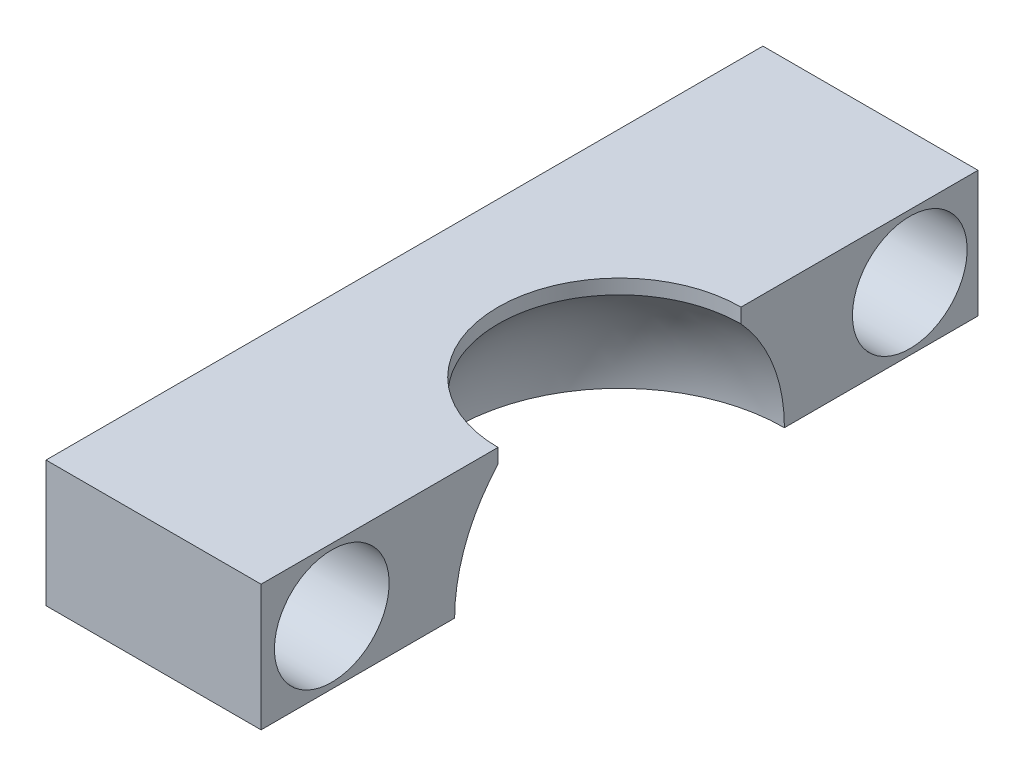
ISO-10303-21;
HEADER;
FILE_DESCRIPTION(('STEP AP214'),'2;1');
FILE_NAME('part.step','',(''),(''),'','','');
FILE_SCHEMA(('AUTOMOTIVE_DESIGN { 1 0 10303 214 1 1 1 1 }'));
ENDSEC;
DATA;
#1=APPLICATION_CONTEXT('core data for automotive mechanical design processes');
#2=APPLICATION_PROTOCOL_DEFINITION('international standard','automotive_design',2000,#1);
#3=PRODUCT_CONTEXT('',#1,'mechanical');
#4=PRODUCT('Part','Part','',(#3));
#5=PRODUCT_RELATED_PRODUCT_CATEGORY('part','',(#4));
#6=PRODUCT_DEFINITION_FORMATION('','',#4);
#7=PRODUCT_DEFINITION_CONTEXT('part definition',#1,'design');
#8=PRODUCT_DEFINITION('design','',#6,#7);
#9=PRODUCT_DEFINITION_SHAPE('','',#8);
#10=(LENGTH_UNIT() NAMED_UNIT(*) SI_UNIT(.MILLI.,.METRE.));
#11=(NAMED_UNIT(*) PLANE_ANGLE_UNIT() SI_UNIT($,.RADIAN.));
#12=(NAMED_UNIT(*) SI_UNIT($,.STERADIAN.) SOLID_ANGLE_UNIT());
#13=UNCERTAINTY_MEASURE_WITH_UNIT(LENGTH_MEASURE(1.E-05),#10,'distance_accuracy_value','');
#14=(GEOMETRIC_REPRESENTATION_CONTEXT(3) GLOBAL_UNCERTAINTY_ASSIGNED_CONTEXT((#13)) GLOBAL_UNIT_ASSIGNED_CONTEXT((#10,
#11,#12)) REPRESENTATION_CONTEXT('',''));
#15=CARTESIAN_POINT('',(0.,0.,0.));
#16=DIRECTION('',(0.,0.,1.));
#17=DIRECTION('',(1.,0.,0.));
#18=AXIS2_PLACEMENT_3D('',#15,#16,#17);
#19=CARTESIAN_POINT('',(1.5,1.56,-5.));
#20=DIRECTION('',(-1.,0.,0.));
#21=DIRECTION('',(0.,0.,1.));
#22=AXIS2_PLACEMENT_3D('',#19,#20,#21);
#23=PLANE('',#22);
#24=CARTESIAN_POINT('',(1.5,0.881745601262196,4.01387258980179));
#25=DIRECTION('',(-1.,0.,0.));
#26=DIRECTION('',(0.,0.,1.));
#27=AXIS2_PLACEMENT_3D('',#24,#25,#26);
#28=CIRCLE('',#27,0.8);
#29=CARTESIAN_POINT('',(1.5,0.881745601262196,4.81387258980179));
#30=VERTEX_POINT('',#29);
#31=EDGE_CURVE('E125',#30,#30,#28,.T.);
#32=ORIENTED_EDGE('',*,*,#31,.T.);
#33=EDGE_LOOP('',(#32));
#34=FACE_BOUND('',#33,.T.);
#35=DIRECTION('',(0.,0.,-1.));
#36=VECTOR('',#35,1.);
#37=CARTESIAN_POINT('',(1.5,0.,-5.));
#38=LINE('',#37,#36);
#39=CARTESIAN_POINT('',(1.5,0.,5.));
#40=VERTEX_POINT('',#39);
#41=CARTESIAN_POINT('',(1.5,0.,2.3));
#42=VERTEX_POINT('',#41);
#43=EDGE_CURVE('E190',#40,#42,#38,.T.);
#44=ORIENTED_EDGE('',*,*,#43,.T.);
#45=CARTESIAN_POINT('',(1.5,0.,0.));
#46=DIRECTION('',(-1.,0.,0.));
#47=DIRECTION('',(0.,0.,1.));
#48=AXIS2_PLACEMENT_3D('',#45,#46,#47);
#49=CIRCLE('',#48,2.3);
#50=CARTESIAN_POINT('',(1.5,1.56,1.69254437753292));
#51=VERTEX_POINT('',#50);
#52=EDGE_CURVE('E43',#42,#51,#49,.T.);
#53=ORIENTED_EDGE('',*,*,#52,.T.);
#54=DIRECTION('',(0.,-1.,0.));
#55=VECTOR('',#54,1.);
#56=CARTESIAN_POINT('',(1.5,1.76,1.695));
#57=LINE('',#56,#55);
#58=CARTESIAN_POINT('',(1.5,1.76,1.695));
#59=VERTEX_POINT('',#58);
#60=EDGE_CURVE('E113',#59,#51,#57,.T.);
#61=ORIENTED_EDGE('',*,*,#60,.F.);
#62=DIRECTION('',(0.,0.,-1.));
#63=VECTOR('',#62,1.);
#64=CARTESIAN_POINT('',(1.5,1.76,1.695));
#65=LINE('',#64,#63);
#66=CARTESIAN_POINT('',(1.5,1.76,5.));
#67=VERTEX_POINT('',#66);
#68=EDGE_CURVE('E111',#67,#59,#65,.T.);
#69=ORIENTED_EDGE('',*,*,#68,.F.);
#70=DIRECTION('',(0.,-1.,0.));
#71=VECTOR('',#70,1.);
#72=CARTESIAN_POINT('',(1.5,1.56,5.));
#73=LINE('',#72,#71);
#74=EDGE_CURVE('E99',#67,#40,#73,.T.);
#75=ORIENTED_EDGE('',*,*,#74,.T.);
#76=EDGE_LOOP('',(#44,#53,#61,#69,#75));
#77=FACE_BOUND('',#76,.T.);
#78=ADVANCED_FACE('F39',(#34,#77),#23,.F.);
#79=CARTESIAN_POINT('',(1.5,0.88,-4.04863887629148));
#80=DIRECTION('',(-1.,0.,0.));
#81=DIRECTION('',(0.,0.,1.));
#82=AXIS2_PLACEMENT_3D('',#79,#80,#81);
#83=CIRCLE('',#82,0.8);
#84=CARTESIAN_POINT('',(1.5,0.88,-3.24863887629148));
#85=VERTEX_POINT('',#84);
#86=EDGE_CURVE('E129',#85,#85,#83,.T.);
#87=ORIENTED_EDGE('',*,*,#86,.T.);
#88=EDGE_LOOP('',(#87));
#89=FACE_BOUND('',#88,.T.);
#90=DIRECTION('',(0.,-1.,0.));
#91=VECTOR('',#90,1.);
#92=CARTESIAN_POINT('',(1.5,1.56,-5.));
#93=LINE('',#92,#91);
#94=CARTESIAN_POINT('',(1.5,1.76,-5.));
#95=VERTEX_POINT('',#94);
#96=CARTESIAN_POINT('',(1.5,0.,-5.));
#97=VERTEX_POINT('',#96);
#98=EDGE_CURVE('E50',#95,#97,#93,.T.);
#99=ORIENTED_EDGE('',*,*,#98,.F.);
#100=DIRECTION('',(0.,0.,-1.));
#101=VECTOR('',#100,1.);
#102=CARTESIAN_POINT('',(1.5,1.76,-5.));
#103=LINE('',#102,#101);
#104=CARTESIAN_POINT('',(1.5,1.76,-1.695));
#105=VERTEX_POINT('',#104);
#106=EDGE_CURVE('E135',#105,#95,#103,.T.);
#107=ORIENTED_EDGE('',*,*,#106,.F.);
#108=DIRECTION('',(0.,-1.,0.));
#109=VECTOR('',#108,1.);
#110=CARTESIAN_POINT('',(1.5,1.76,-1.695));
#111=LINE('',#110,#109);
#112=CARTESIAN_POINT('',(1.5,1.56,-1.69254437753292));
#113=VERTEX_POINT('',#112);
#114=EDGE_CURVE('E144',#105,#113,#111,.T.);
#115=ORIENTED_EDGE('',*,*,#114,.T.);
#116=CARTESIAN_POINT('',(1.5,0.,-2.3));
#117=VERTEX_POINT('',#116);
#118=EDGE_CURVE('E177',#113,#117,#49,.T.);
#119=ORIENTED_EDGE('',*,*,#118,.T.);
#120=EDGE_CURVE('E195',#117,#97,#38,.T.);
#121=ORIENTED_EDGE('',*,*,#120,.T.);
#122=EDGE_LOOP('',(#99,#107,#115,#119,#121));
#123=FACE_BOUND('',#122,.T.);
#124=ADVANCED_FACE('F41',(#89,#123),#23,.F.);
#125=CARTESIAN_POINT('',(-1.5,1.56,-5.));
#126=DIRECTION('',(0.,0.,1.));
#127=DIRECTION('',(1.,0.,0.));
#128=AXIS2_PLACEMENT_3D('',#125,#126,#127);
#129=PLANE('',#128);
#130=DIRECTION('',(-1.,0.,0.));
#131=VECTOR('',#130,1.);
#132=CARTESIAN_POINT('',(-1.5,0.,-5.));
#133=LINE('',#132,#131);
#134=CARTESIAN_POINT('',(-1.5,0.,-5.));
#135=VERTEX_POINT('',#134);
#136=EDGE_CURVE('E194',#97,#135,#133,.T.);
#137=ORIENTED_EDGE('',*,*,#136,.T.);
#138=DIRECTION('',(0.,-1.,0.));
#139=VECTOR('',#138,1.);
#140=CARTESIAN_POINT('',(-1.5,1.56,-5.));
#141=LINE('',#140,#139);
#142=CARTESIAN_POINT('',(-1.5,1.76,-5.));
#143=VERTEX_POINT('',#142);
#144=EDGE_CURVE('E205',#143,#135,#141,.T.);
#145=ORIENTED_EDGE('',*,*,#144,.F.);
#146=DIRECTION('',(-1.,0.,0.));
#147=VECTOR('',#146,1.);
#148=CARTESIAN_POINT('',(-1.5,1.76,-5.));
#149=LINE('',#148,#147);
#150=EDGE_CURVE('E139',#95,#143,#149,.T.);
#151=ORIENTED_EDGE('',*,*,#150,.F.);
#152=ORIENTED_EDGE('',*,*,#98,.T.);
#153=EDGE_LOOP('',(#137,#145,#151,#152));
#154=FACE_BOUND('',#153,.T.);
#155=ADVANCED_FACE('F213',(#154),#129,.F.);
#156=CARTESIAN_POINT('',(-1.5,1.56,-5.));
#157=DIRECTION('',(1.,0.,0.));
#158=DIRECTION('',(0.,0.,-1.));
#159=AXIS2_PLACEMENT_3D('',#156,#157,#158);
#160=PLANE('',#159);
#161=CARTESIAN_POINT('',(-1.5,0.881745601262196,4.01387258980179));
#162=DIRECTION('',(-1.,0.,0.));
#163=DIRECTION('',(0.,0.,1.));
#164=AXIS2_PLACEMENT_3D('',#161,#162,#163);
#165=CIRCLE('',#164,0.8);
#166=CARTESIAN_POINT('',(-1.5,0.881745601262196,4.81387258980179));
#167=VERTEX_POINT('',#166);
#168=EDGE_CURVE('E255',#167,#167,#165,.T.);
#169=ORIENTED_EDGE('',*,*,#168,.F.);
#170=EDGE_LOOP('',(#169));
#171=FACE_BOUND('',#170,.T.);
#172=CARTESIAN_POINT('',(-1.5,0.88,-4.04863887629148));
#173=DIRECTION('',(-1.,0.,0.));
#174=DIRECTION('',(0.,0.,1.));
#175=AXIS2_PLACEMENT_3D('',#172,#173,#174);
#176=CIRCLE('',#175,0.8);
#177=CARTESIAN_POINT('',(-1.5,0.88,-3.24863887629148));
#178=VERTEX_POINT('',#177);
#179=EDGE_CURVE('E257',#178,#178,#176,.T.);
#180=ORIENTED_EDGE('',*,*,#179,.F.);
#181=EDGE_LOOP('',(#180));
#182=FACE_BOUND('',#181,.T.);
#183=DIRECTION('',(0.,0.,1.));
#184=VECTOR('',#183,1.);
#185=CARTESIAN_POINT('',(-1.5,0.,-5.));
#186=LINE('',#185,#184);
#187=CARTESIAN_POINT('',(-1.5,0.,5.));
#188=VERTEX_POINT('',#187);
#189=EDGE_CURVE('E198',#135,#188,#186,.T.);
#190=ORIENTED_EDGE('',*,*,#189,.T.);
#191=DIRECTION('',(0.,-1.,0.));
#192=VECTOR('',#191,1.);
#193=CARTESIAN_POINT('',(-1.5,1.56,5.));
#194=LINE('',#193,#192);
#195=CARTESIAN_POINT('',(-1.5,1.76,5.));
#196=VERTEX_POINT('',#195);
#197=EDGE_CURVE('E108',#196,#188,#194,.T.);
#198=ORIENTED_EDGE('',*,*,#197,.F.);
#199=DIRECTION('',(0.,0.,1.));
#200=VECTOR('',#199,1.);
#201=CARTESIAN_POINT('',(-1.5,1.76,-5.));
#202=LINE('',#201,#200);
#203=EDGE_CURVE('E123',#143,#196,#202,.T.);
#204=ORIENTED_EDGE('',*,*,#203,.F.);
#205=ORIENTED_EDGE('',*,*,#144,.T.);
#206=EDGE_LOOP('',(#190,#198,#204,#205));
#207=FACE_BOUND('',#206,.T.);
#208=ADVANCED_FACE('F227',(#171,#182,#207),#160,.F.);
#209=CARTESIAN_POINT('',(-1.5,1.56,5.));
#210=DIRECTION('',(0.,0.,-1.));
#211=DIRECTION('',(-1.,0.,0.));
#212=AXIS2_PLACEMENT_3D('',#209,#210,#211);
#213=PLANE('',#212);
#214=DIRECTION('',(1.,0.,0.));
#215=VECTOR('',#214,1.);
#216=CARTESIAN_POINT('',(-1.5,0.,5.));
#217=LINE('',#216,#215);
#218=EDGE_CURVE('E64',#188,#40,#217,.T.);
#219=ORIENTED_EDGE('',*,*,#218,.T.);
#220=ORIENTED_EDGE('',*,*,#74,.F.);
#221=DIRECTION('',(1.,0.,0.));
#222=VECTOR('',#221,1.);
#223=CARTESIAN_POINT('',(-1.5,1.76,5.));
#224=LINE('',#223,#222);
#225=EDGE_CURVE('E103',#196,#67,#224,.T.);
#226=ORIENTED_EDGE('',*,*,#225,.F.);
#227=ORIENTED_EDGE('',*,*,#197,.T.);
#228=EDGE_LOOP('',(#219,#220,#226,#227));
#229=FACE_BOUND('',#228,.T.);
#230=ADVANCED_FACE('F101',(#229),#213,.F.);
#231=CARTESIAN_POINT('',(0.,0.,0.));
#232=DIRECTION('',(0.,1.,0.));
#233=DIRECTION('',(0.,0.,1.));
#234=AXIS2_PLACEMENT_3D('',#231,#232,#233);
#235=PLANE('',#234);
#236=ORIENTED_EDGE('',*,*,#120,.F.);
#237=CARTESIAN_POINT('',(1.5,0.,0.));
#238=DIRECTION('',(0.,1.,0.));
#239=DIRECTION('',(0.,0.,1.));
#240=AXIS2_PLACEMENT_3D('',#237,#238,#239);
#241=CIRCLE('',#240,2.3);
#242=EDGE_CURVE('E11',#117,#42,#241,.T.);
#243=ORIENTED_EDGE('',*,*,#242,.T.);
#244=ORIENTED_EDGE('',*,*,#43,.F.);
#245=ORIENTED_EDGE('',*,*,#218,.F.);
#246=ORIENTED_EDGE('',*,*,#189,.F.);
#247=ORIENTED_EDGE('',*,*,#136,.F.);
#248=EDGE_LOOP('',(#236,#243,#244,#245,#246,#247));
#249=FACE_BOUND('',#248,.T.);
#250=ADVANCED_FACE('F171',(#249),#235,.F.);
#251=CARTESIAN_POINT('',(1.5,0.,0.));
#252=DIRECTION('',(0.,1.,0.));
#253=DIRECTION('',(1.,0.,0.));
#254=AXIS2_PLACEMENT_3D('',#251,#252,#253);
#255=SPHERICAL_SURFACE('',#254,2.3);
#256=CARTESIAN_POINT('',(1.5,1.56,-1.69008875506584));
#257=CARTESIAN_POINT('',(1.47234595948626,1.56,-1.69008934167668));
#258=CARTESIAN_POINT('',(1.44469196888735,1.56,-1.68941004436484));
#259=CARTESIAN_POINT('',(1.38945058187664,1.56,-1.68669589392161));
#260=CARTESIAN_POINT('',(1.36186318546484,1.56,-1.68466104079022));
#261=CARTESIAN_POINT('',(1.30682148118576,1.56,-1.6792399907337));
#262=CARTESIAN_POINT('',(1.27936717331849,1.56,-1.67585379380857));
#263=CARTESIAN_POINT('',(1.22465777687654,1.56,-1.66773839872494));
#264=CARTESIAN_POINT('',(1.19740268830186,1.56,-1.66300920056645));
#265=CARTESIAN_POINT('',(1.14315739277487,1.56,-1.65221914652076));
#266=CARTESIAN_POINT('',(1.11616718582256,1.56,-1.64615829063356));
#267=CARTESIAN_POINT('',(1.06251667466068,1.56,-1.6327195355395));
#268=CARTESIAN_POINT('',(1.03585637045112,1.56,-1.62534163633263));
#269=CARTESIAN_POINT('',(0.982929891957514,1.56,-1.60928656504725));
#270=CARTESIAN_POINT('',(0.956663717673473,1.56,-1.60060939296875));
#271=CARTESIAN_POINT('',(0.904588776498582,1.56,-1.58197668096086));
#272=CARTESIAN_POINT('',(0.878780009607732,1.56,-1.57202114103149));
#273=CARTESIAN_POINT('',(0.82768205881179,1.56,-1.55085567683414));
#274=CARTESIAN_POINT('',(0.802392874906698,1.56,-1.53964575256618));
#275=CARTESIAN_POINT('',(0.752395013938009,1.56,-1.51599852544953));
#276=CARTESIAN_POINT('',(0.727686336874412,1.56,-1.50356122260085));
#277=CARTESIAN_POINT('',(0.678909014956884,1.56,-1.47748920085637));
#278=CARTESIAN_POINT('',(0.654840370102953,1.56,-1.46385448196057));
#279=CARTESIAN_POINT('',(0.607401096078134,1.56,-1.43542047535886));
#280=CARTESIAN_POINT('',(0.584030466907245,1.56,-1.42062118765295));
#281=CARTESIAN_POINT('',(0.538043526141273,1.56,-1.38989369621003));
#282=CARTESIAN_POINT('',(0.51542721454619,1.56,-1.37396549247303));
#283=CARTESIAN_POINT('',(0.471003393607398,1.56,-1.34101854140624));
#284=CARTESIAN_POINT('',(0.44919588426369,1.56,-1.32399979407645));
#285=CARTESIAN_POINT('',(0.406442204027774,1.56,-1.28891275547698));
#286=CARTESIAN_POINT('',(0.385496033135567,1.56,-1.27084446420729));
#287=CARTESIAN_POINT('',(0.344515490962999,1.56,-1.23370186582431));
#288=CARTESIAN_POINT('',(0.324481119682638,1.56,-1.21462755871102));
#289=CARTESIAN_POINT('',(0.285372441288983,1.56,-1.17551888031736));
#290=CARTESIAN_POINT('',(0.266298134175688,1.56,-1.155484509037));
#291=CARTESIAN_POINT('',(0.229155535792712,1.56,-1.11450396686443));
#292=CARTESIAN_POINT('',(0.21108724452303,1.56,-1.09355779597223));
#293=CARTESIAN_POINT('',(0.176000205923544,1.56,-1.05080411573631));
#294=CARTESIAN_POINT('',(0.15898145859374,1.56,-1.0289966063926));
#295=CARTESIAN_POINT('',(0.126034507526992,1.56,-0.984572785453809));
#296=CARTESIAN_POINT('',(0.110106303790049,1.56,-0.961956473858723));
#297=CARTESIAN_POINT('',(0.0793788123469717,1.56,-0.915969533092759));
#298=CARTESIAN_POINT('',(0.0645795246408375,1.56,-0.892598903921881));
#299=CARTESIAN_POINT('',(0.0361455180397269,1.56,-0.845159629897032));
#300=CARTESIAN_POINT('',(0.0225107991447506,1.56,-0.821090985043061));
#301=CARTESIAN_POINT('',(-0.00356122260196587,1.56,-0.772313663125643));
#302=CARTESIAN_POINT('',(-0.015998525453706,1.56,-0.747604986062196));
#303=CARTESIAN_POINT('',(-0.0396457525620013,1.56,-0.697607125093097));
#304=CARTESIAN_POINT('',(-0.0508556768185564,1.56,-0.672317941187445));
#305=CARTESIAN_POINT('',(-0.0720211410470745,1.56,-0.621219990393034));
#306=CARTESIAN_POINT('',(-0.0819766810190375,1.56,-0.595411223504275));
#307=CARTESIAN_POINT('',(-0.100609392910576,1.56,-0.543336282323669));
#308=CARTESIAN_POINT('',(-0.109286564830151,1.56,-0.517070108031821));
#309=CARTESIAN_POINT('',(-0.12534163654973,1.56,-0.464143629559549));
#310=CARTESIAN_POINT('',(-0.132719536349734,1.56,-0.437483325379125));
#311=CARTESIAN_POINT('',(-0.146158289823323,1.56,-0.383832814137639));
#312=CARTESIAN_POINT('',(-0.152219143496909,1.56,-0.356842607076577));
#313=CARTESIAN_POINT('',(-0.163009203590295,1.56,-0.302597311846688));
#314=CARTESIAN_POINT('',(-0.167738410010095,1.56,-0.275342223677861));
#315=CARTESIAN_POINT('',(-0.175853782523414,1.56,-0.220632826127105));
#316=CARTESIAN_POINT('',(-0.179239948616934,1.56,-0.193178516745175));
#317=CARTESIAN_POINT('',(-0.18466108290698,1.56,-0.138136816604227));
#318=CARTESIAN_POINT('',(-0.186696051103507,1.56,-0.11054942584521));
#319=CARTESIAN_POINT('',(-0.189409887182939,1.56,-0.0553080233907947));
#320=CARTESIAN_POINT('',(-0.190088755065845,1.56,-0.0276540116953974));
#321=CARTESIAN_POINT('',(-0.190088755065845,1.56,0.0276540116953973));
#322=CARTESIAN_POINT('',(-0.189409887182939,1.56,0.0553080233907948));
#323=CARTESIAN_POINT('',(-0.186696051103507,1.56,0.11054942584521));
#324=CARTESIAN_POINT('',(-0.18466108290698,1.56,0.138136816604228));
#325=CARTESIAN_POINT('',(-0.179239948616934,1.56,0.193178516745175));
#326=CARTESIAN_POINT('',(-0.175853782523414,1.56,0.220632826127105));
#327=CARTESIAN_POINT('',(-0.167738410010094,1.56,0.275342223677862));
#328=CARTESIAN_POINT('',(-0.163009203590295,1.56,0.302597311846689));
#329=CARTESIAN_POINT('',(-0.152219143496909,1.56,0.356842607076577));
#330=CARTESIAN_POINT('',(-0.146158289823323,1.56,0.383832814137639));
#331=CARTESIAN_POINT('',(-0.132719536349734,1.56,0.437483325379125));
#332=CARTESIAN_POINT('',(-0.12534163654973,1.56,0.464143629559549));
#333=CARTESIAN_POINT('',(-0.109286564830151,1.56,0.517070108031821));
#334=CARTESIAN_POINT('',(-0.100609392910576,1.56,0.543336282323669));
#335=CARTESIAN_POINT('',(-0.0819766810190376,1.56,0.595411223504275));
#336=CARTESIAN_POINT('',(-0.0720211410470747,1.56,0.621219990393034));
#337=CARTESIAN_POINT('',(-0.0508556768185566,1.56,0.672317941187444));
#338=CARTESIAN_POINT('',(-0.0396457525620013,1.56,0.697607125093097));
#339=CARTESIAN_POINT('',(-0.015998525453706,1.56,0.747604986062196));
#340=CARTESIAN_POINT('',(-0.00356122260196604,1.56,0.772313663125643));
#341=CARTESIAN_POINT('',(0.0225107991447506,1.56,0.821090985043061));
#342=CARTESIAN_POINT('',(0.0361455180397273,1.56,0.845159629897033));
#343=CARTESIAN_POINT('',(0.0645795246408378,1.56,0.892598903921881));
#344=CARTESIAN_POINT('',(0.0793788123469716,1.56,0.915969533092759));
#345=CARTESIAN_POINT('',(0.110106303790049,1.56,0.961956473858723));
#346=CARTESIAN_POINT('',(0.126034507526992,1.56,0.984572785453809));
#347=CARTESIAN_POINT('',(0.15898145859374,1.56,1.0289966063926));
#348=CARTESIAN_POINT('',(0.176000205923544,1.56,1.05080411573631));
#349=CARTESIAN_POINT('',(0.21108724452303,1.56,1.09355779597223));
#350=CARTESIAN_POINT('',(0.229155535792712,1.56,1.11450396686443));
#351=CARTESIAN_POINT('',(0.266298134175689,1.56,1.155484509037));
#352=CARTESIAN_POINT('',(0.285372441288983,1.56,1.17551888031736));
#353=CARTESIAN_POINT('',(0.324481119682638,1.56,1.21462755871102));
#354=CARTESIAN_POINT('',(0.344515490962999,1.56,1.23370186582431));
#355=CARTESIAN_POINT('',(0.385496033135567,1.56,1.27084446420729));
#356=CARTESIAN_POINT('',(0.406442204027774,1.56,1.28891275547698));
#357=CARTESIAN_POINT('',(0.449195884263689,1.56,1.32399979407645));
#358=CARTESIAN_POINT('',(0.471003393607398,1.56,1.34101854140624));
#359=CARTESIAN_POINT('',(0.515427214546189,1.56,1.37396549247303));
#360=CARTESIAN_POINT('',(0.538043526141273,1.56,1.38989369621003));
#361=CARTESIAN_POINT('',(0.584030466907245,1.56,1.42062118765295));
#362=CARTESIAN_POINT('',(0.607401096078133,1.56,1.43542047535886));
#363=CARTESIAN_POINT('',(0.654840370102953,1.56,1.46385448196057));
#364=CARTESIAN_POINT('',(0.678909014956884,1.56,1.47748920085637));
#365=CARTESIAN_POINT('',(0.727686336874412,1.56,1.50356122260085));
#366=CARTESIAN_POINT('',(0.752395013938009,1.56,1.51599852544953));
#367=CARTESIAN_POINT('',(0.802392874906698,1.56,1.53964575256618));
#368=CARTESIAN_POINT('',(0.827682058811791,1.56,1.55085567683414));
#369=CARTESIAN_POINT('',(0.878780009607733,1.56,1.57202114103149));
#370=CARTESIAN_POINT('',(0.904588776498583,1.56,1.58197668096086));
#371=CARTESIAN_POINT('',(0.956663717673474,1.56,1.60060939296875));
#372=CARTESIAN_POINT('',(0.982929891957514,1.56,1.60928656504725));
#373=CARTESIAN_POINT('',(1.03585637045112,1.56,1.62534163633263));
#374=CARTESIAN_POINT('',(1.06251667466068,1.56,1.6327195355395));
#375=CARTESIAN_POINT('',(1.11616718582256,1.56,1.64615829063356));
#376=CARTESIAN_POINT('',(1.14315739277487,1.56,1.65221914652076));
#377=CARTESIAN_POINT('',(1.19740268830186,1.56,1.66300920056645));
#378=CARTESIAN_POINT('',(1.22465777687654,1.56,1.66773839872494));
#379=CARTESIAN_POINT('',(1.27936717331849,1.56,1.67585379380857));
#380=CARTESIAN_POINT('',(1.30682148118576,1.56,1.6792399907337));
#381=CARTESIAN_POINT('',(1.36186318546484,1.56,1.68466104079022));
#382=CARTESIAN_POINT('',(1.38945058187664,1.56,1.68669589392161));
#383=CARTESIAN_POINT('',(1.44469196888735,1.56,1.68941004436484));
#384=CARTESIAN_POINT('',(1.47234595948626,1.56,1.69008934167668));
#385=CARTESIAN_POINT('',(1.5,1.56,1.69008875506584));
#386=B_SPLINE_CURVE_WITH_KNOTS('',3,(#256,#257,#258,#259,#260,#261,#262,#263,#264,#265,#266,
#267,#268,#269,#270,#271,#272,#273,#274,#275,#276,#277,#278,#279,#280,#281,#282,#283,#284,#285,
#286,#287,#288,#289,#290,#291,#292,#293,#294,#295,#296,#297,#298,#299,#300,#301,#302,#303,#304,
#305,#306,#307,#308,#309,#310,#311,#312,#313,#314,#315,#316,#317,#318,#319,#320,#321,#322,#323,
#324,#325,#326,#327,#328,#329,#330,#331,#332,#333,#334,#335,#336,#337,#338,#339,#340,#341,#342,
#343,#344,#345,#346,#347,#348,#349,#350,#351,#352,#353,#354,#355,#356,#357,#358,#359,#360,#361,
#362,#363,#364,#365,#366,#367,#368,#369,#370,#371,#372,#373,#374,#375,#376,#377,#378,#379,#380,
#381,#382,#383,#384,#385),.UNSPECIFIED.,.F.,.F.,(4,2,2,2,2,2,2,2,2,2,2,2,2,2,2,2,2,2,2,2,2,2,2,
2,2,2,2,2,2,2,2,2,2,2,2,2,2,2,2,2,2,2,2,2,2,2,2,2,2,2,2,2,2,2,2,2,2,2,2,2,2,2,2,2,4),(0.,
0.0829537087241504,0.165907417448301,0.248861126172452,0.331814834896602,0.414768543620752,
0.497722252344903,0.580675961069054,0.663629669793204,0.746583378517354,0.829537087241505,
0.912490795965655,0.995444504689806,1.07839821341396,1.16135192213811,1.24430563086226,
1.32725933958641,1.41021304831056,1.49316675703471,1.57612046575886,1.65907417448301,
1.74202788320716,1.82498159193131,1.90793530065546,1.99088900937961,2.07384271810376,
2.15679642682791,2.23975013555206,2.32270384427621,2.40565755300036,2.48861126172451,
2.57156497044866,2.65451867917282,2.73747238789697,2.82042609662112,2.90337980534527,
2.98633351406942,3.06928722279357,3.15224093151772,3.23519464024187,3.31814834896602,
3.40110205769017,3.48405576641432,3.56700947513847,3.64996318386262,3.73291689258677,
3.81587060131092,3.89882431003507,3.98177801875922,4.06473172748337,4.14768543620752,
4.23063914493167,4.31359285365582,4.39654656237997,4.47950027110413,4.56245397982828,
4.64540768855243,4.72836139727658,4.81131510600073,4.89426881472488,4.97722252344903,
5.06017623217318,5.14312994089733,5.22608364962148,5.30903735834563),.UNSPECIFIED.);
#387=EDGE_CURVE('E149',#113,#51,#386,.T.);
#388=ORIENTED_EDGE('',*,*,#387,.T.);
#389=ORIENTED_EDGE('',*,*,#52,.F.);
#390=ORIENTED_EDGE('',*,*,#242,.F.);
#391=ORIENTED_EDGE('',*,*,#118,.F.);
#392=EDGE_LOOP('',(#388,#389,#390,#391));
#393=FACE_BOUND('',#392,.T.);
#394=ADVANCED_FACE('F166',(#393),#255,.F.);
#395=CARTESIAN_POINT('',(1.5,1.76,0.));
#396=DIRECTION('',(0.,-1.,0.));
#397=DIRECTION('',(0.,0.,-1.));
#398=AXIS2_PLACEMENT_3D('',#395,#396,#397);
#399=CYLINDRICAL_SURFACE('',#398,1.695);
#400=ORIENTED_EDGE('',*,*,#387,.F.);
#401=ORIENTED_EDGE('',*,*,#114,.F.);
#402=CARTESIAN_POINT('',(1.5,1.76,0.));
#403=DIRECTION('',(0.,-1.,0.));
#404=DIRECTION('',(0.,0.,1.));
#405=AXIS2_PLACEMENT_3D('',#402,#403,#404);
#406=CIRCLE('',#405,1.695);
#407=EDGE_CURVE('E117',#59,#105,#406,.T.);
#408=ORIENTED_EDGE('',*,*,#407,.F.);
#409=ORIENTED_EDGE('',*,*,#60,.T.);
#410=EDGE_LOOP('',(#400,#401,#408,#409));
#411=FACE_BOUND('',#410,.T.);
#412=ADVANCED_FACE('F156',(#411),#399,.F.);
#413=CARTESIAN_POINT('',(1.5,1.76,0.));
#414=DIRECTION('',(0.,1.,0.));
#415=DIRECTION('',(0.,0.,1.));
#416=AXIS2_PLACEMENT_3D('',#413,#414,#415);
#417=PLANE('',#416);
#418=ORIENTED_EDGE('',*,*,#225,.T.);
#419=ORIENTED_EDGE('',*,*,#68,.T.);
#420=ORIENTED_EDGE('',*,*,#407,.T.);
#421=ORIENTED_EDGE('',*,*,#106,.T.);
#422=ORIENTED_EDGE('',*,*,#150,.T.);
#423=ORIENTED_EDGE('',*,*,#203,.T.);
#424=EDGE_LOOP('',(#418,#419,#420,#421,#422,#423));
#425=FACE_BOUND('',#424,.T.);
#426=ADVANCED_FACE('F120',(#425),#417,.T.);
#427=CARTESIAN_POINT('',(3.5,0.88,-4.04863887629148));
#428=DIRECTION('',(-1.,0.,0.));
#429=DIRECTION('',(0.,0.,1.));
#430=AXIS2_PLACEMENT_3D('',#427,#428,#429);
#431=CYLINDRICAL_SURFACE('',#430,0.8);
#432=ORIENTED_EDGE('',*,*,#179,.T.);
#433=EDGE_LOOP('',(#432));
#434=FACE_BOUND('',#433,.T.);
#435=ORIENTED_EDGE('',*,*,#86,.F.);
#436=EDGE_LOOP('',(#435));
#437=FACE_BOUND('',#436,.T.);
#438=ADVANCED_FACE('F247',(#434,#437),#431,.F.);
#439=CARTESIAN_POINT('',(3.5,0.881745601262196,4.01387258980179));
#440=DIRECTION('',(-1.,0.,0.));
#441=DIRECTION('',(0.,0.,1.));
#442=AXIS2_PLACEMENT_3D('',#439,#440,#441);
#443=CYLINDRICAL_SURFACE('',#442,0.8);
#444=ORIENTED_EDGE('',*,*,#168,.T.);
#445=EDGE_LOOP('',(#444));
#446=FACE_BOUND('',#445,.T.);
#447=ORIENTED_EDGE('',*,*,#31,.F.);
#448=EDGE_LOOP('',(#447));
#449=FACE_BOUND('',#448,.T.);
#450=ADVANCED_FACE('F245',(#446,#449),#443,.F.);
#451=CLOSED_SHELL('',(#78,#124,#155,#208,#230,#250,#394,#412,#426,#438,#450));
#452=MANIFOLD_SOLID_BREP('B2',#451);
#453=ADVANCED_BREP_SHAPE_REPRESENTATION('',(#18,#452),#14);
#454=SHAPE_DEFINITION_REPRESENTATION(#9,#453);
ENDSEC;
END-ISO-10303-21;
